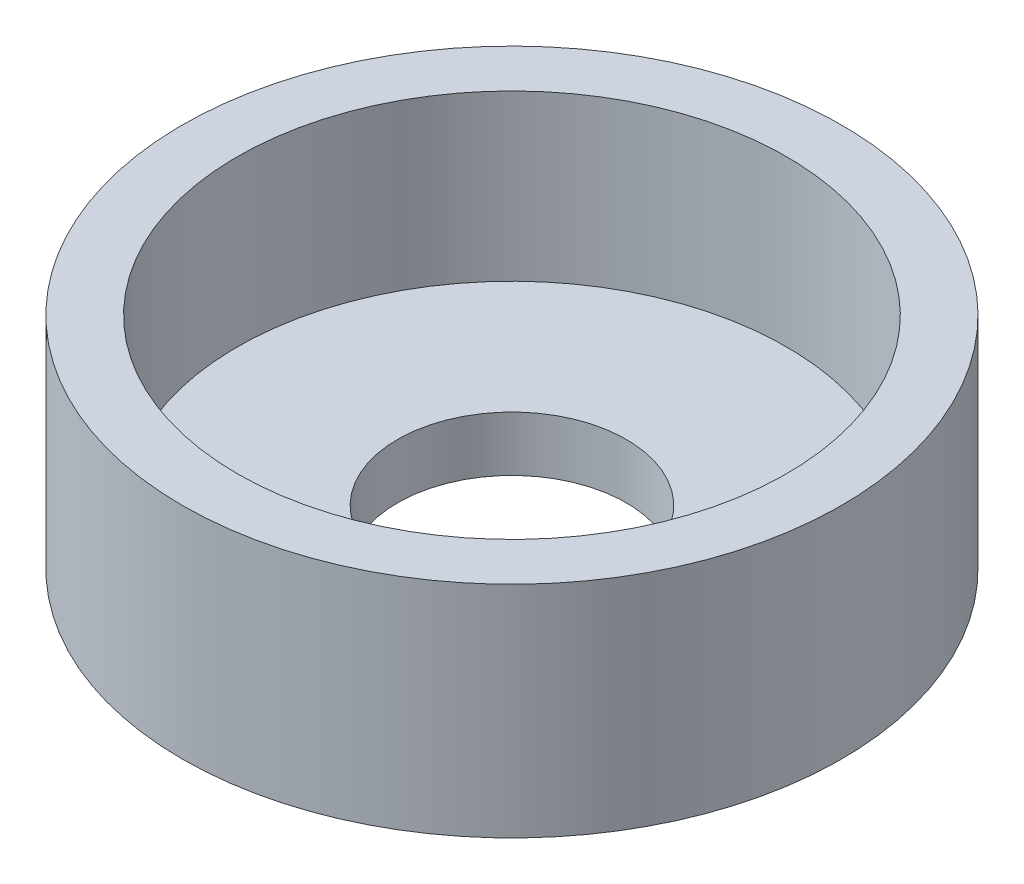
ISO-10303-21;
HEADER;
FILE_DESCRIPTION(('STEP AP214'),'2;1');
FILE_NAME('part.step','',(''),(''),'','','');
FILE_SCHEMA(('AUTOMOTIVE_DESIGN { 1 0 10303 214 1 1 1 1 }'));
ENDSEC;
DATA;
#1=APPLICATION_CONTEXT('core data for automotive mechanical design processes');
#2=APPLICATION_PROTOCOL_DEFINITION('international standard','automotive_design',2000,#1);
#3=PRODUCT_CONTEXT('',#1,'mechanical');
#4=PRODUCT('Part','Part','',(#3));
#5=PRODUCT_RELATED_PRODUCT_CATEGORY('part','',(#4));
#6=PRODUCT_DEFINITION_FORMATION('','',#4);
#7=PRODUCT_DEFINITION_CONTEXT('part definition',#1,'design');
#8=PRODUCT_DEFINITION('design','',#6,#7);
#9=PRODUCT_DEFINITION_SHAPE('','',#8);
#10=(LENGTH_UNIT() NAMED_UNIT(*) SI_UNIT(.MILLI.,.METRE.));
#11=(NAMED_UNIT(*) PLANE_ANGLE_UNIT() SI_UNIT($,.RADIAN.));
#12=(NAMED_UNIT(*) SI_UNIT($,.STERADIAN.) SOLID_ANGLE_UNIT());
#13=UNCERTAINTY_MEASURE_WITH_UNIT(LENGTH_MEASURE(1.E-05),#10,'distance_accuracy_value','');
#14=(GEOMETRIC_REPRESENTATION_CONTEXT(3) GLOBAL_UNCERTAINTY_ASSIGNED_CONTEXT((#13)) GLOBAL_UNIT_ASSIGNED_CONTEXT((#10,
#11,#12)) REPRESENTATION_CONTEXT('',''));
#15=CARTESIAN_POINT('',(0.,0.,0.));
#16=DIRECTION('',(0.,0.,1.));
#17=DIRECTION('',(1.,0.,0.));
#18=AXIS2_PLACEMENT_3D('',#15,#16,#17);
#19=CARTESIAN_POINT('',(0.,12.,0.));
#20=DIRECTION('',(0.,-1.,0.));
#21=DIRECTION('',(0.,0.,-1.));
#22=AXIS2_PLACEMENT_3D('',#19,#20,#21);
#23=CYLINDRICAL_SURFACE('',#22,18.);
#24=CARTESIAN_POINT('',(0.,12.,0.));
#25=DIRECTION('',(0.,1.,0.));
#26=DIRECTION('',(0.,0.,1.));
#27=AXIS2_PLACEMENT_3D('',#24,#25,#26);
#28=CIRCLE('',#27,18.);
#29=CARTESIAN_POINT('',(0.,12.,18.));
#30=VERTEX_POINT('',#29);
#31=EDGE_CURVE('E10',#30,#30,#28,.T.);
#32=ORIENTED_EDGE('',*,*,#31,.F.);
#33=EDGE_LOOP('',(#32));
#34=FACE_BOUND('',#33,.T.);
#35=CARTESIAN_POINT('',(0.,0.,0.));
#36=DIRECTION('',(0.,1.,0.));
#37=DIRECTION('',(0.,0.,1.));
#38=AXIS2_PLACEMENT_3D('',#35,#36,#37);
#39=CIRCLE('',#38,18.);
#40=CARTESIAN_POINT('',(0.,0.,18.));
#41=VERTEX_POINT('',#40);
#42=EDGE_CURVE('E41',#41,#41,#39,.T.);
#43=ORIENTED_EDGE('',*,*,#42,.T.);
#44=EDGE_LOOP('',(#43));
#45=FACE_BOUND('',#44,.T.);
#46=ADVANCED_FACE('F34',(#34,#45),#23,.T.);
#47=CARTESIAN_POINT('',(0.,12.,0.));
#48=DIRECTION('',(0.,1.,0.));
#49=DIRECTION('',(0.,0.,1.));
#50=AXIS2_PLACEMENT_3D('',#47,#48,#49);
#51=PLANE('',#50);
#52=CARTESIAN_POINT('',(0.,12.,0.));
#53=DIRECTION('',(0.,1.,0.));
#54=DIRECTION('',(0.,0.,1.));
#55=AXIS2_PLACEMENT_3D('',#52,#53,#54);
#56=CIRCLE('',#55,15.);
#57=CARTESIAN_POINT('',(0.,12.,15.));
#58=VERTEX_POINT('',#57);
#59=EDGE_CURVE('E48',#58,#58,#56,.T.);
#60=ORIENTED_EDGE('',*,*,#59,.F.);
#61=EDGE_LOOP('',(#60));
#62=FACE_BOUND('',#61,.T.);
#63=ORIENTED_EDGE('',*,*,#31,.T.);
#64=EDGE_LOOP('',(#63));
#65=FACE_BOUND('',#64,.T.);
#66=ADVANCED_FACE('F74',(#62,#65),#51,.T.);
#67=CARTESIAN_POINT('',(0.,0.,0.));
#68=DIRECTION('',(0.,1.,0.));
#69=DIRECTION('',(0.,0.,1.));
#70=AXIS2_PLACEMENT_3D('',#67,#68,#69);
#71=PLANE('',#70);
#72=CARTESIAN_POINT('',(0.,0.,0.));
#73=DIRECTION('',(0.,1.,0.));
#74=DIRECTION('',(0.,0.,1.));
#75=AXIS2_PLACEMENT_3D('',#72,#73,#74);
#76=CIRCLE('',#75,6.25);
#77=CARTESIAN_POINT('',(0.,0.,6.25));
#78=VERTEX_POINT('',#77);
#79=EDGE_CURVE('E37',#78,#78,#76,.T.);
#80=ORIENTED_EDGE('',*,*,#79,.T.);
#81=EDGE_LOOP('',(#80));
#82=FACE_BOUND('',#81,.T.);
#83=ORIENTED_EDGE('',*,*,#42,.F.);
#84=EDGE_LOOP('',(#83));
#85=FACE_BOUND('',#84,.T.);
#86=ADVANCED_FACE('F60',(#82,#85),#71,.F.);
#87=CARTESIAN_POINT('',(0.,3.,0.));
#88=DIRECTION('',(0.,1.,0.));
#89=DIRECTION('',(0.,0.,1.));
#90=AXIS2_PLACEMENT_3D('',#87,#88,#89);
#91=CYLINDRICAL_SURFACE('',#90,15.);
#92=CARTESIAN_POINT('',(0.,3.,0.));
#93=DIRECTION('',(0.,1.,0.));
#94=DIRECTION('',(0.,0.,1.));
#95=AXIS2_PLACEMENT_3D('',#92,#93,#94);
#96=CIRCLE('',#95,15.);
#97=CARTESIAN_POINT('',(0.,3.,15.));
#98=VERTEX_POINT('',#97);
#99=EDGE_CURVE('E46',#98,#98,#96,.T.);
#100=ORIENTED_EDGE('',*,*,#99,.F.);
#101=EDGE_LOOP('',(#100));
#102=FACE_BOUND('',#101,.T.);
#103=ORIENTED_EDGE('',*,*,#59,.T.);
#104=EDGE_LOOP('',(#103));
#105=FACE_BOUND('',#104,.T.);
#106=ADVANCED_FACE('F70',(#102,#105),#91,.F.);
#107=CARTESIAN_POINT('',(0.,3.,0.));
#108=DIRECTION('',(0.,1.,0.));
#109=DIRECTION('',(0.,0.,1.));
#110=AXIS2_PLACEMENT_3D('',#107,#108,#109);
#111=PLANE('',#110);
#112=CARTESIAN_POINT('',(0.,3.,0.));
#113=DIRECTION('',(0.,1.,0.));
#114=DIRECTION('',(0.,0.,1.));
#115=AXIS2_PLACEMENT_3D('',#112,#113,#114);
#116=CIRCLE('',#115,6.25);
#117=CARTESIAN_POINT('',(0.,3.,6.25));
#118=VERTEX_POINT('',#117);
#119=EDGE_CURVE('E53',#118,#118,#116,.T.);
#120=ORIENTED_EDGE('',*,*,#119,.F.);
#121=EDGE_LOOP('',(#120));
#122=FACE_BOUND('',#121,.T.);
#123=ORIENTED_EDGE('',*,*,#99,.T.);
#124=EDGE_LOOP('',(#123));
#125=FACE_BOUND('',#124,.T.);
#126=ADVANCED_FACE('F65',(#122,#125),#111,.T.);
#127=CARTESIAN_POINT('',(0.,-6.,0.));
#128=DIRECTION('',(0.,1.,0.));
#129=DIRECTION('',(0.,0.,1.));
#130=AXIS2_PLACEMENT_3D('',#127,#128,#129);
#131=CYLINDRICAL_SURFACE('',#130,6.25);
#132=ORIENTED_EDGE('',*,*,#119,.T.);
#133=EDGE_LOOP('',(#132));
#134=FACE_BOUND('',#133,.T.);
#135=ORIENTED_EDGE('',*,*,#79,.F.);
#136=EDGE_LOOP('',(#135));
#137=FACE_BOUND('',#136,.T.);
#138=ADVANCED_FACE('F63',(#134,#137),#131,.F.);
#139=CLOSED_SHELL('',(#46,#66,#86,#106,#126,#138));
#140=MANIFOLD_SOLID_BREP('B2',#139);
#141=ADVANCED_BREP_SHAPE_REPRESENTATION('',(#18,#140),#14);
#142=SHAPE_DEFINITION_REPRESENTATION(#9,#141);
ENDSEC;
END-ISO-10303-21;
